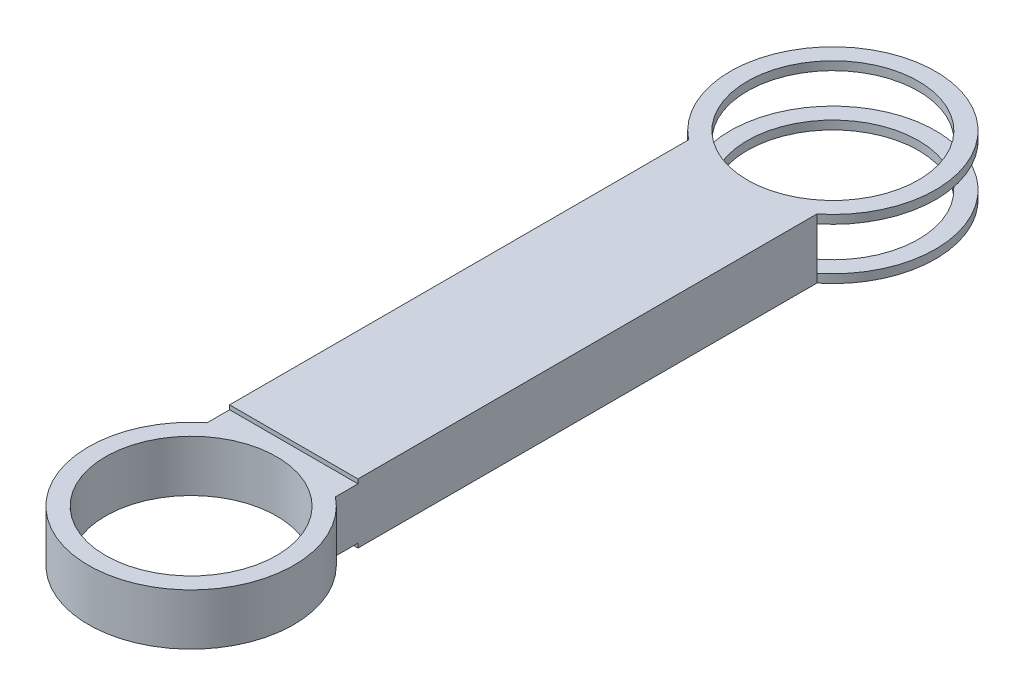
ISO-10303-21;
HEADER;
FILE_DESCRIPTION(('STEP AP214'),'2;1');
FILE_NAME('part.step','',(''),(''),'','','');
FILE_SCHEMA(('AUTOMOTIVE_DESIGN { 1 0 10303 214 1 1 1 1 }'));
ENDSEC;
DATA;
#1=APPLICATION_CONTEXT('core data for automotive mechanical design processes');
#2=APPLICATION_PROTOCOL_DEFINITION('international standard','automotive_design',2000,#1);
#3=PRODUCT_CONTEXT('',#1,'mechanical');
#4=PRODUCT('Part','Part','',(#3));
#5=PRODUCT_RELATED_PRODUCT_CATEGORY('part','',(#4));
#6=PRODUCT_DEFINITION_FORMATION('','',#4);
#7=PRODUCT_DEFINITION_CONTEXT('part definition',#1,'design');
#8=PRODUCT_DEFINITION('design','',#6,#7);
#9=PRODUCT_DEFINITION_SHAPE('','',#8);
#10=(LENGTH_UNIT() NAMED_UNIT(*) SI_UNIT(.MILLI.,.METRE.));
#11=(NAMED_UNIT(*) PLANE_ANGLE_UNIT() SI_UNIT($,.RADIAN.));
#12=(NAMED_UNIT(*) SI_UNIT($,.STERADIAN.) SOLID_ANGLE_UNIT());
#13=UNCERTAINTY_MEASURE_WITH_UNIT(LENGTH_MEASURE(1.E-05),#10,'distance_accuracy_value','');
#14=(GEOMETRIC_REPRESENTATION_CONTEXT(3) GLOBAL_UNCERTAINTY_ASSIGNED_CONTEXT((#13)) GLOBAL_UNIT_ASSIGNED_CONTEXT((#10,
#11,#12)) REPRESENTATION_CONTEXT('',''));
#15=CARTESIAN_POINT('',(0.,0.,0.));
#16=DIRECTION('',(0.,0.,1.));
#17=DIRECTION('',(1.,0.,0.));
#18=AXIS2_PLACEMENT_3D('',#15,#16,#17);
#19=CARTESIAN_POINT('',(0.,7.,-37.5));
#20=DIRECTION('',(0.,-1.,0.));
#21=DIRECTION('',(0.,0.,-1.));
#22=AXIS2_PLACEMENT_3D('',#19,#20,#21);
#23=CYLINDRICAL_SURFACE('',#22,12.);
#24=DIRECTION('',(0.,-1.,0.));
#25=VECTOR('',#24,1.);
#26=CARTESIAN_POINT('',(-7.50000000000001,7.,-28.1325030024024));
#27=LINE('',#26,#25);
#28=CARTESIAN_POINT('',(-7.50000000000001,0.999999999999997,-28.1325030024024));
#29=VERTEX_POINT('',#28);
#30=CARTESIAN_POINT('',(-7.50000000000001,0.,-28.1325030024024));
#31=VERTEX_POINT('',#30);
#32=EDGE_CURVE('E221',#29,#31,#27,.T.);
#33=ORIENTED_EDGE('',*,*,#32,.F.);
#34=CARTESIAN_POINT('',(0.,0.999999999999998,-37.5));
#35=DIRECTION('',(0.,-1.,0.));
#36=DIRECTION('',(0.,0.,-1.));
#37=AXIS2_PLACEMENT_3D('',#34,#35,#36);
#38=CIRCLE('',#37,12.);
#39=CARTESIAN_POINT('',(7.50000000000001,0.999999999999997,-28.1325030024024));
#40=VERTEX_POINT('',#39);
#41=EDGE_CURVE('E157',#40,#29,#38,.F.);
#42=ORIENTED_EDGE('',*,*,#41,.F.);
#43=DIRECTION('',(0.,-1.,0.));
#44=VECTOR('',#43,1.);
#45=CARTESIAN_POINT('',(7.5,7.,-28.1325030024024));
#46=LINE('',#45,#44);
#47=CARTESIAN_POINT('',(7.5,0.,-28.1325030024024));
#48=VERTEX_POINT('',#47);
#49=EDGE_CURVE('E225',#40,#48,#46,.T.);
#50=ORIENTED_EDGE('',*,*,#49,.T.);
#51=CARTESIAN_POINT('',(0.,0.,-37.5));
#52=DIRECTION('',(0.,1.,0.));
#53=DIRECTION('',(0.,0.,1.));
#54=AXIS2_PLACEMENT_3D('',#51,#52,#53);
#55=CIRCLE('',#54,12.);
#56=EDGE_CURVE('E215',#48,#31,#55,.T.);
#57=ORIENTED_EDGE('',*,*,#56,.T.);
#58=EDGE_LOOP('',(#33,#42,#50,#57));
#59=FACE_BOUND('',#58,.T.);
#60=ADVANCED_FACE('F40',(#59),#23,.T.);
#61=CARTESIAN_POINT('',(0.,7.,-37.5));
#62=DIRECTION('',(0.,-1.,0.));
#63=DIRECTION('',(0.,0.,-1.));
#64=AXIS2_PLACEMENT_3D('',#61,#62,#63);
#65=CYLINDRICAL_SURFACE('',#64,10.);
#66=CARTESIAN_POINT('',(0.,0.999999999999998,-37.5));
#67=DIRECTION('',(0.,-1.,0.));
#68=DIRECTION('',(0.,0.,-1.));
#69=AXIS2_PLACEMENT_3D('',#66,#67,#68);
#70=CIRCLE('',#69,10.);
#71=CARTESIAN_POINT('',(0.,1.,-47.5));
#72=VERTEX_POINT('',#71);
#73=EDGE_CURVE('E44',#72,#72,#70,.T.);
#74=ORIENTED_EDGE('',*,*,#73,.F.);
#75=EDGE_LOOP('',(#74));
#76=FACE_BOUND('',#75,.T.);
#77=CARTESIAN_POINT('',(0.,0.,-37.5));
#78=DIRECTION('',(0.,1.,0.));
#79=DIRECTION('',(0.,0.,1.));
#80=AXIS2_PLACEMENT_3D('',#77,#78,#79);
#81=CIRCLE('',#80,10.);
#82=CARTESIAN_POINT('',(0.,0.,-27.5));
#83=VERTEX_POINT('',#82);
#84=EDGE_CURVE('E201',#83,#83,#81,.T.);
#85=ORIENTED_EDGE('',*,*,#84,.F.);
#86=EDGE_LOOP('',(#85));
#87=FACE_BOUND('',#86,.T.);
#88=ADVANCED_FACE('F242',(#76,#87),#65,.F.);
#89=CARTESIAN_POINT('',(0.,7.,37.5));
#90=DIRECTION('',(0.,1.,0.));
#91=DIRECTION('',(0.,0.,1.));
#92=AXIS2_PLACEMENT_3D('',#89,#90,#91);
#93=PLANE('',#92);
#94=CARTESIAN_POINT('',(0.,7.,-37.5));
#95=DIRECTION('',(0.,1.,0.));
#96=DIRECTION('',(0.,0.,1.));
#97=AXIS2_PLACEMENT_3D('',#94,#95,#96);
#98=CIRCLE('',#97,10.);
#99=CARTESIAN_POINT('',(0.,7.,-27.5));
#100=VERTEX_POINT('',#99);
#101=EDGE_CURVE('E197',#100,#100,#98,.T.);
#102=ORIENTED_EDGE('',*,*,#101,.F.);
#103=EDGE_LOOP('',(#102));
#104=FACE_BOUND('',#103,.T.);
#105=DIRECTION('',(0.,0.,1.));
#106=VECTOR('',#105,1.);
#107=CARTESIAN_POINT('',(-7.50000000000001,7.,-28.1325030024024));
#108=LINE('',#107,#106);
#109=CARTESIAN_POINT('',(-7.50000000000001,7.,-28.1325030024024));
#110=VERTEX_POINT('',#109);
#111=CARTESIAN_POINT('',(-7.50000000000001,7.,25.5));
#112=VERTEX_POINT('',#111);
#113=EDGE_CURVE('E209',#110,#112,#108,.T.);
#114=ORIENTED_EDGE('',*,*,#113,.T.);
#115=DIRECTION('',(1.,0.,0.));
#116=VECTOR('',#115,1.);
#117=CARTESIAN_POINT('',(0.,7.,25.5));
#118=LINE('',#117,#116);
#119=CARTESIAN_POINT('',(7.5,7.,25.5));
#120=VERTEX_POINT('',#119);
#121=EDGE_CURVE('E164',#112,#120,#118,.T.);
#122=ORIENTED_EDGE('',*,*,#121,.T.);
#123=DIRECTION('',(0.,0.,-1.));
#124=VECTOR('',#123,1.);
#125=CARTESIAN_POINT('',(7.5,7.,-28.1325030024024));
#126=LINE('',#125,#124);
#127=CARTESIAN_POINT('',(7.5,7.,-28.1325030024024));
#128=VERTEX_POINT('',#127);
#129=EDGE_CURVE('E204',#120,#128,#126,.T.);
#130=ORIENTED_EDGE('',*,*,#129,.T.);
#131=CARTESIAN_POINT('',(0.,7.,-37.5));
#132=DIRECTION('',(0.,1.,0.));
#133=DIRECTION('',(0.,0.,1.));
#134=AXIS2_PLACEMENT_3D('',#131,#132,#133);
#135=CIRCLE('',#134,12.);
#136=EDGE_CURVE('E206',#128,#110,#135,.T.);
#137=ORIENTED_EDGE('',*,*,#136,.T.);
#138=EDGE_LOOP('',(#114,#122,#130,#137));
#139=FACE_BOUND('',#138,.T.);
#140=ADVANCED_FACE('F245',(#104,#139),#93,.T.);
#141=CARTESIAN_POINT('',(0.,7.,37.5));
#142=DIRECTION('',(0.,-1.,0.));
#143=DIRECTION('',(0.,0.,-1.));
#144=AXIS2_PLACEMENT_3D('',#141,#142,#143);
#145=CYLINDRICAL_SURFACE('',#144,12.);
#146=CARTESIAN_POINT('',(0.,6.5,37.5));
#147=DIRECTION('',(0.,1.,0.));
#148=DIRECTION('',(0.,0.,1.));
#149=AXIS2_PLACEMENT_3D('',#146,#147,#148);
#150=CIRCLE('',#149,12.);
#151=CARTESIAN_POINT('',(-7.5,6.5,28.1325030024024));
#152=VERTEX_POINT('',#151);
#153=CARTESIAN_POINT('',(7.50000000000001,6.5,28.1325030024024));
#154=VERTEX_POINT('',#153);
#155=EDGE_CURVE('E169',#152,#154,#150,.T.);
#156=ORIENTED_EDGE('',*,*,#155,.F.);
#157=DIRECTION('',(0.,-1.,0.));
#158=VECTOR('',#157,1.);
#159=CARTESIAN_POINT('',(-7.49999999999999,7.,28.1325030024024));
#160=LINE('',#159,#158);
#161=CARTESIAN_POINT('',(-7.49999999999999,0.5,28.1325030024024));
#162=VERTEX_POINT('',#161);
#163=EDGE_CURVE('E212',#152,#162,#160,.T.);
#164=ORIENTED_EDGE('',*,*,#163,.T.);
#165=CARTESIAN_POINT('',(0.,0.5,37.5));
#166=DIRECTION('',(0.,1.,0.));
#167=DIRECTION('',(0.,0.,1.));
#168=AXIS2_PLACEMENT_3D('',#165,#166,#167);
#169=CIRCLE('',#168,12.);
#170=CARTESIAN_POINT('',(7.50000000000001,0.5,28.1325030024024));
#171=VERTEX_POINT('',#170);
#172=EDGE_CURVE('E187',#162,#171,#169,.T.);
#173=ORIENTED_EDGE('',*,*,#172,.T.);
#174=DIRECTION('',(0.,-1.,0.));
#175=VECTOR('',#174,1.);
#176=CARTESIAN_POINT('',(7.5,7.,28.1325030024024));
#177=LINE('',#176,#175);
#178=EDGE_CURVE('E11',#154,#171,#177,.T.);
#179=ORIENTED_EDGE('',*,*,#178,.F.);
#180=EDGE_LOOP('',(#156,#164,#173,#179));
#181=FACE_BOUND('',#180,.T.);
#182=ADVANCED_FACE('F42',(#181),#145,.T.);
#183=CARTESIAN_POINT('',(7.5,7.,-28.1325030024024));
#184=DIRECTION('',(-1.,0.,0.));
#185=DIRECTION('',(0.,0.,1.));
#186=AXIS2_PLACEMENT_3D('',#183,#184,#185);
#187=PLANE('',#186);
#188=DIRECTION('',(0.,1.,0.));
#189=VECTOR('',#188,1.);
#190=CARTESIAN_POINT('',(7.5,6.5,25.5));
#191=LINE('',#190,#189);
#192=CARTESIAN_POINT('',(7.5,6.5,25.5));
#193=VERTEX_POINT('',#192);
#194=EDGE_CURVE('E171',#193,#120,#191,.T.);
#195=ORIENTED_EDGE('',*,*,#194,.F.);
#196=DIRECTION('',(0.,0.,1.));
#197=VECTOR('',#196,1.);
#198=CARTESIAN_POINT('',(7.50000000000001,6.5,37.5));
#199=LINE('',#198,#197);
#200=EDGE_CURVE('E166',#193,#154,#199,.T.);
#201=ORIENTED_EDGE('',*,*,#200,.T.);
#202=ORIENTED_EDGE('',*,*,#178,.T.);
#203=DIRECTION('',(0.,0.,1.));
#204=VECTOR('',#203,1.);
#205=CARTESIAN_POINT('',(7.50000000000001,0.5,37.5));
#206=LINE('',#205,#204);
#207=CARTESIAN_POINT('',(7.5,0.5,25.5));
#208=VERTEX_POINT('',#207);
#209=EDGE_CURVE('E184',#208,#171,#206,.T.);
#210=ORIENTED_EDGE('',*,*,#209,.F.);
#211=DIRECTION('',(0.,-1.,0.));
#212=VECTOR('',#211,1.);
#213=CARTESIAN_POINT('',(7.5,0.5,25.5));
#214=LINE('',#213,#212);
#215=CARTESIAN_POINT('',(7.5,0.,25.5));
#216=VERTEX_POINT('',#215);
#217=EDGE_CURVE('E192',#208,#216,#214,.T.);
#218=ORIENTED_EDGE('',*,*,#217,.T.);
#219=DIRECTION('',(0.,0.,-1.));
#220=VECTOR('',#219,1.);
#221=CARTESIAN_POINT('',(7.5,0.,-28.1325030024024));
#222=LINE('',#221,#220);
#223=EDGE_CURVE('E200',#216,#48,#222,.T.);
#224=ORIENTED_EDGE('',*,*,#223,.T.);
#225=ORIENTED_EDGE('',*,*,#49,.F.);
#226=CARTESIAN_POINT('',(7.50000000000001,6.,-28.1325030024024));
#227=VERTEX_POINT('',#226);
#228=EDGE_CURVE('E228',#227,#40,#46,.T.);
#229=ORIENTED_EDGE('',*,*,#228,.F.);
#230=EDGE_CURVE('E49',#128,#227,#46,.T.);
#231=ORIENTED_EDGE('',*,*,#230,.F.);
#232=ORIENTED_EDGE('',*,*,#129,.F.);
#233=EDGE_LOOP('',(#195,#201,#202,#210,#218,#224,#225,#229,#231,#232));
#234=FACE_BOUND('',#233,.T.);
#235=ADVANCED_FACE('F277',(#234),#187,.F.);
#236=CARTESIAN_POINT('',(-7.50000000000001,7.,-28.1325030024024));
#237=DIRECTION('',(1.,0.,0.));
#238=DIRECTION('',(0.,0.,-1.));
#239=AXIS2_PLACEMENT_3D('',#236,#237,#238);
#240=PLANE('',#239);
#241=DIRECTION('',(0.,1.,0.));
#242=VECTOR('',#241,1.);
#243=CARTESIAN_POINT('',(-7.50000000000001,6.5,25.5));
#244=LINE('',#243,#242);
#245=CARTESIAN_POINT('',(-7.49999999999999,6.5,25.5));
#246=VERTEX_POINT('',#245);
#247=EDGE_CURVE('E65',#246,#112,#244,.T.);
#248=ORIENTED_EDGE('',*,*,#247,.T.);
#249=ORIENTED_EDGE('',*,*,#113,.F.);
#250=CARTESIAN_POINT('',(-7.50000000000001,6.,-28.1325030024024));
#251=VERTEX_POINT('',#250);
#252=EDGE_CURVE('E222',#110,#251,#27,.T.);
#253=ORIENTED_EDGE('',*,*,#252,.T.);
#254=EDGE_CURVE('E226',#251,#29,#27,.T.);
#255=ORIENTED_EDGE('',*,*,#254,.T.);
#256=ORIENTED_EDGE('',*,*,#32,.T.);
#257=DIRECTION('',(0.,0.,1.));
#258=VECTOR('',#257,1.);
#259=CARTESIAN_POINT('',(-7.50000000000001,0.,-28.1325030024024));
#260=LINE('',#259,#258);
#261=CARTESIAN_POINT('',(-7.50000000000001,0.,25.5));
#262=VERTEX_POINT('',#261);
#263=EDGE_CURVE('E207',#31,#262,#260,.T.);
#264=ORIENTED_EDGE('',*,*,#263,.T.);
#265=DIRECTION('',(0.,-1.,0.));
#266=VECTOR('',#265,1.);
#267=CARTESIAN_POINT('',(-7.50000000000001,0.5,25.5));
#268=LINE('',#267,#266);
#269=CARTESIAN_POINT('',(-7.50000000000001,0.5,25.5));
#270=VERTEX_POINT('',#269);
#271=EDGE_CURVE('E190',#270,#262,#268,.T.);
#272=ORIENTED_EDGE('',*,*,#271,.F.);
#273=DIRECTION('',(0.,0.,-1.));
#274=VECTOR('',#273,1.);
#275=CARTESIAN_POINT('',(-7.5,0.5,37.5));
#276=LINE('',#275,#274);
#277=EDGE_CURVE('E177',#162,#270,#276,.T.);
#278=ORIENTED_EDGE('',*,*,#277,.F.);
#279=ORIENTED_EDGE('',*,*,#163,.F.);
#280=DIRECTION('',(0.,0.,-1.));
#281=VECTOR('',#280,1.);
#282=CARTESIAN_POINT('',(-7.5,6.5,37.5));
#283=LINE('',#282,#281);
#284=EDGE_CURVE('E160',#152,#246,#283,.T.);
#285=ORIENTED_EDGE('',*,*,#284,.T.);
#286=EDGE_LOOP('',(#248,#249,#253,#255,#256,#264,#272,#278,#279,#285));
#287=FACE_BOUND('',#286,.T.);
#288=ADVANCED_FACE('F264',(#287),#240,.F.);
#289=CARTESIAN_POINT('',(0.,7.,37.5));
#290=DIRECTION('',(0.,-1.,0.));
#291=DIRECTION('',(0.,0.,-1.));
#292=AXIS2_PLACEMENT_3D('',#289,#290,#291);
#293=CYLINDRICAL_SURFACE('',#292,10.);
#294=CARTESIAN_POINT('',(0.,0.5,37.5));
#295=DIRECTION('',(0.,1.,0.));
#296=DIRECTION('',(0.,0.,1.));
#297=AXIS2_PLACEMENT_3D('',#294,#295,#296);
#298=CIRCLE('',#297,10.);
#299=CARTESIAN_POINT('',(0.,0.5,47.5));
#300=VERTEX_POINT('',#299);
#301=EDGE_CURVE('E195',#300,#300,#298,.T.);
#302=ORIENTED_EDGE('',*,*,#301,.F.);
#303=EDGE_LOOP('',(#302));
#304=FACE_BOUND('',#303,.T.);
#305=CARTESIAN_POINT('',(0.,6.5,37.5));
#306=DIRECTION('',(0.,1.,0.));
#307=DIRECTION('',(0.,0.,1.));
#308=AXIS2_PLACEMENT_3D('',#305,#306,#307);
#309=CIRCLE('',#308,10.);
#310=CARTESIAN_POINT('',(0.,6.5,47.5));
#311=VERTEX_POINT('',#310);
#312=EDGE_CURVE('E176',#311,#311,#309,.T.);
#313=ORIENTED_EDGE('',*,*,#312,.T.);
#314=EDGE_LOOP('',(#313));
#315=FACE_BOUND('',#314,.T.);
#316=ADVANCED_FACE('F253',(#304,#315),#293,.F.);
#317=CARTESIAN_POINT('',(0.,0.,37.5));
#318=DIRECTION('',(0.,1.,0.));
#319=DIRECTION('',(0.,0.,1.));
#320=AXIS2_PLACEMENT_3D('',#317,#318,#319);
#321=PLANE('',#320);
#322=ORIENTED_EDGE('',*,*,#223,.F.);
#323=DIRECTION('',(1.,0.,0.));
#324=VECTOR('',#323,1.);
#325=CARTESIAN_POINT('',(0.,0.,25.5));
#326=LINE('',#325,#324);
#327=EDGE_CURVE('E181',#262,#216,#326,.T.);
#328=ORIENTED_EDGE('',*,*,#327,.F.);
#329=ORIENTED_EDGE('',*,*,#263,.F.);
#330=ORIENTED_EDGE('',*,*,#56,.F.);
#331=EDGE_LOOP('',(#322,#328,#329,#330));
#332=FACE_BOUND('',#331,.T.);
#333=ORIENTED_EDGE('',*,*,#84,.T.);
#334=EDGE_LOOP('',(#333));
#335=FACE_BOUND('',#334,.T.);
#336=ADVANCED_FACE('F250',(#332,#335),#321,.F.);
#337=ORIENTED_EDGE('',*,*,#230,.T.);
#338=CARTESIAN_POINT('',(0.,6.,-37.5));
#339=DIRECTION('',(0.,1.,0.));
#340=DIRECTION('',(0.,0.,1.));
#341=AXIS2_PLACEMENT_3D('',#338,#339,#340);
#342=CIRCLE('',#341,12.);
#343=EDGE_CURVE('E134',#251,#227,#342,.F.);
#344=ORIENTED_EDGE('',*,*,#343,.F.);
#345=ORIENTED_EDGE('',*,*,#252,.F.);
#346=ORIENTED_EDGE('',*,*,#136,.F.);
#347=EDGE_LOOP('',(#337,#344,#345,#346));
#348=FACE_BOUND('',#347,.T.);
#349=ADVANCED_FACE('F252',(#348),#23,.T.);
#350=CARTESIAN_POINT('',(0.,6.,-37.5));
#351=DIRECTION('',(0.,1.,0.));
#352=DIRECTION('',(0.,0.,1.));
#353=AXIS2_PLACEMENT_3D('',#350,#351,#352);
#354=CIRCLE('',#353,10.);
#355=CARTESIAN_POINT('',(0.,6.,-27.5));
#356=VERTEX_POINT('',#355);
#357=EDGE_CURVE('E156',#356,#356,#354,.T.);
#358=ORIENTED_EDGE('',*,*,#357,.F.);
#359=EDGE_LOOP('',(#358));
#360=FACE_BOUND('',#359,.T.);
#361=ORIENTED_EDGE('',*,*,#101,.T.);
#362=EDGE_LOOP('',(#361));
#363=FACE_BOUND('',#362,.T.);
#364=ADVANCED_FACE('F247',(#360,#363),#65,.F.);
#365=CARTESIAN_POINT('',(0.,0.5,25.5));
#366=DIRECTION('',(0.,0.,-1.));
#367=DIRECTION('',(-1.,0.,0.));
#368=AXIS2_PLACEMENT_3D('',#365,#366,#367);
#369=PLANE('',#368);
#370=ORIENTED_EDGE('',*,*,#327,.T.);
#371=ORIENTED_EDGE('',*,*,#217,.F.);
#372=DIRECTION('',(1.,0.,0.));
#373=VECTOR('',#372,1.);
#374=CARTESIAN_POINT('',(0.,0.5,25.5));
#375=LINE('',#374,#373);
#376=EDGE_CURVE('E180',#270,#208,#375,.T.);
#377=ORIENTED_EDGE('',*,*,#376,.F.);
#378=ORIENTED_EDGE('',*,*,#271,.T.);
#379=EDGE_LOOP('',(#370,#371,#377,#378));
#380=FACE_BOUND('',#379,.T.);
#381=ADVANCED_FACE('F308',(#380),#369,.F.);
#382=CARTESIAN_POINT('',(0.,0.5,37.5));
#383=DIRECTION('',(0.,1.,0.));
#384=DIRECTION('',(0.,0.,1.));
#385=AXIS2_PLACEMENT_3D('',#382,#383,#384);
#386=PLANE('',#385);
#387=ORIENTED_EDGE('',*,*,#301,.T.);
#388=EDGE_LOOP('',(#387));
#389=FACE_BOUND('',#388,.T.);
#390=ORIENTED_EDGE('',*,*,#277,.T.);
#391=ORIENTED_EDGE('',*,*,#376,.T.);
#392=ORIENTED_EDGE('',*,*,#209,.T.);
#393=ORIENTED_EDGE('',*,*,#172,.F.);
#394=EDGE_LOOP('',(#390,#391,#392,#393));
#395=FACE_BOUND('',#394,.T.);
#396=ADVANCED_FACE('F305',(#389,#395),#386,.F.);
#397=CARTESIAN_POINT('',(0.,6.5,25.5));
#398=DIRECTION('',(0.,0.,1.));
#399=DIRECTION('',(1.,0.,0.));
#400=AXIS2_PLACEMENT_3D('',#397,#398,#399);
#401=PLANE('',#400);
#402=ORIENTED_EDGE('',*,*,#121,.F.);
#403=ORIENTED_EDGE('',*,*,#247,.F.);
#404=DIRECTION('',(1.,0.,0.));
#405=VECTOR('',#404,1.);
#406=CARTESIAN_POINT('',(0.,6.5,25.5));
#407=LINE('',#406,#405);
#408=EDGE_CURVE('E163',#246,#193,#407,.T.);
#409=ORIENTED_EDGE('',*,*,#408,.T.);
#410=ORIENTED_EDGE('',*,*,#194,.T.);
#411=EDGE_LOOP('',(#402,#403,#409,#410));
#412=FACE_BOUND('',#411,.T.);
#413=ADVANCED_FACE('F291',(#412),#401,.T.);
#414=CARTESIAN_POINT('',(0.,6.5,37.5));
#415=DIRECTION('',(0.,1.,0.));
#416=DIRECTION('',(0.,0.,1.));
#417=AXIS2_PLACEMENT_3D('',#414,#415,#416);
#418=PLANE('',#417);
#419=ORIENTED_EDGE('',*,*,#312,.F.);
#420=EDGE_LOOP('',(#419));
#421=FACE_BOUND('',#420,.T.);
#422=ORIENTED_EDGE('',*,*,#284,.F.);
#423=ORIENTED_EDGE('',*,*,#155,.T.);
#424=ORIENTED_EDGE('',*,*,#200,.F.);
#425=ORIENTED_EDGE('',*,*,#408,.F.);
#426=EDGE_LOOP('',(#422,#423,#424,#425));
#427=FACE_BOUND('',#426,.T.);
#428=ADVANCED_FACE('F301',(#421,#427),#418,.T.);
#429=CARTESIAN_POINT('',(0.,7.,-37.5));
#430=DIRECTION('',(0.,-1.,0.));
#431=DIRECTION('',(0.,0.,-1.));
#432=AXIS2_PLACEMENT_3D('',#429,#430,#431);
#433=CYLINDRICAL_SURFACE('',#432,12.);
#434=ORIENTED_EDGE('',*,*,#228,.T.);
#435=CARTESIAN_POINT('',(3.84447811927832,0.999999999999997,-26.1325030024024));
#436=VERTEX_POINT('',#435);
#437=EDGE_CURVE('E151',#436,#40,#38,.F.);
#438=ORIENTED_EDGE('',*,*,#437,.F.);
#439=DIRECTION('',(0.,-1.,0.));
#440=VECTOR('',#439,1.);
#441=CARTESIAN_POINT('',(3.84447811927832,7.,-26.1325030024024));
#442=LINE('',#441,#440);
#443=CARTESIAN_POINT('',(3.84447811927832,6.,-26.1325030024024));
#444=VERTEX_POINT('',#443);
#445=EDGE_CURVE('E143',#436,#444,#442,.F.);
#446=ORIENTED_EDGE('',*,*,#445,.T.);
#447=EDGE_CURVE('E129',#227,#444,#342,.F.);
#448=ORIENTED_EDGE('',*,*,#447,.F.);
#449=EDGE_LOOP('',(#434,#438,#446,#448));
#450=FACE_BOUND('',#449,.T.);
#451=ADVANCED_FACE('F149',(#450),#433,.F.);
#452=ORIENTED_EDGE('',*,*,#254,.F.);
#453=CARTESIAN_POINT('',(-3.84447811927832,6.,-26.1325030024024));
#454=VERTEX_POINT('',#453);
#455=EDGE_CURVE('E57',#454,#251,#342,.F.);
#456=ORIENTED_EDGE('',*,*,#455,.F.);
#457=DIRECTION('',(0.,-1.,0.));
#458=VECTOR('',#457,1.);
#459=CARTESIAN_POINT('',(-3.84447811927832,7.,-26.1325030024024));
#460=LINE('',#459,#458);
#461=CARTESIAN_POINT('',(-3.84447811927832,0.999999999999997,-26.1325030024024));
#462=VERTEX_POINT('',#461);
#463=EDGE_CURVE('E145',#462,#454,#460,.F.);
#464=ORIENTED_EDGE('',*,*,#463,.F.);
#465=EDGE_CURVE('E158',#29,#462,#38,.F.);
#466=ORIENTED_EDGE('',*,*,#465,.F.);
#467=EDGE_LOOP('',(#452,#456,#464,#466));
#468=FACE_BOUND('',#467,.T.);
#469=ADVANCED_FACE('F316',(#468),#433,.F.);
#470=CARTESIAN_POINT('',(-12.001,1.,-49.5));
#471=DIRECTION('',(0.,-1.,0.));
#472=DIRECTION('',(0.,0.,-1.));
#473=AXIS2_PLACEMENT_3D('',#470,#471,#472);
#474=PLANE('',#473);
#475=ORIENTED_EDGE('',*,*,#73,.T.);
#476=EDGE_LOOP('',(#475));
#477=FACE_BOUND('',#476,.T.);
#478=ORIENTED_EDGE('',*,*,#437,.T.);
#479=ORIENTED_EDGE('',*,*,#41,.T.);
#480=ORIENTED_EDGE('',*,*,#465,.T.);
#481=DIRECTION('',(1.,0.,0.));
#482=VECTOR('',#481,1.);
#483=CARTESIAN_POINT('',(-12.001,0.999999999999997,-26.1325030024024));
#484=LINE('',#483,#482);
#485=EDGE_CURVE('E146',#462,#436,#484,.T.);
#486=ORIENTED_EDGE('',*,*,#485,.T.);
#487=EDGE_LOOP('',(#478,#479,#480,#486));
#488=FACE_BOUND('',#487,.T.);
#489=ADVANCED_FACE('F239',(#477,#488),#474,.F.);
#490=CARTESIAN_POINT('',(-12.001,6.,-49.5));
#491=DIRECTION('',(0.,1.,0.));
#492=DIRECTION('',(0.,0.,1.));
#493=AXIS2_PLACEMENT_3D('',#490,#491,#492);
#494=PLANE('',#493);
#495=ORIENTED_EDGE('',*,*,#357,.T.);
#496=EDGE_LOOP('',(#495));
#497=FACE_BOUND('',#496,.T.);
#498=ORIENTED_EDGE('',*,*,#455,.T.);
#499=ORIENTED_EDGE('',*,*,#343,.T.);
#500=ORIENTED_EDGE('',*,*,#447,.T.);
#501=DIRECTION('',(1.,0.,0.));
#502=VECTOR('',#501,1.);
#503=CARTESIAN_POINT('',(-12.001,6.,-26.1325030024024));
#504=LINE('',#503,#502);
#505=EDGE_CURVE('E132',#454,#444,#504,.T.);
#506=ORIENTED_EDGE('',*,*,#505,.F.);
#507=EDGE_LOOP('',(#498,#499,#500,#506));
#508=FACE_BOUND('',#507,.T.);
#509=ADVANCED_FACE('F131',(#497,#508),#494,.F.);
#510=CARTESIAN_POINT('',(-12.001,0.999999999999997,-26.1325030024024));
#511=DIRECTION('',(0.,0.,1.));
#512=DIRECTION('',(1.,0.,0.));
#513=AXIS2_PLACEMENT_3D('',#510,#511,#512);
#514=PLANE('',#513);
#515=ORIENTED_EDGE('',*,*,#463,.T.);
#516=ORIENTED_EDGE('',*,*,#505,.T.);
#517=ORIENTED_EDGE('',*,*,#445,.F.);
#518=ORIENTED_EDGE('',*,*,#485,.F.);
#519=EDGE_LOOP('',(#515,#516,#517,#518));
#520=FACE_BOUND('',#519,.T.);
#521=ADVANCED_FACE('F141',(#520),#514,.F.);
#522=CLOSED_SHELL('',(#60,#88,#140,#182,#235,#288,#316,#336,#349,#364,#381,#396,#413,#428,#451,
#469,#489,#509,#521));
#523=MANIFOLD_SOLID_BREP('B2',#522);
#524=ADVANCED_BREP_SHAPE_REPRESENTATION('',(#18,#523),#14);
#525=SHAPE_DEFINITION_REPRESENTATION(#9,#524);
ENDSEC;
END-ISO-10303-21;
